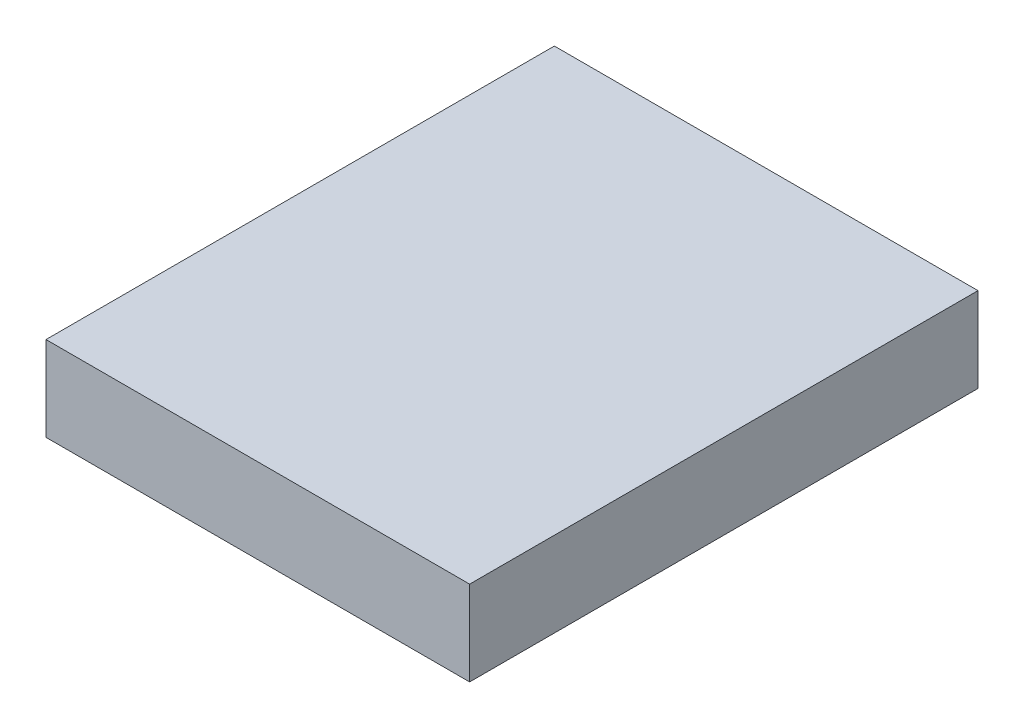
ISO-10303-21;
HEADER;
FILE_DESCRIPTION(('STEP AP214'),'2;1');
FILE_NAME('part.step','',(''),(''),'','','');
FILE_SCHEMA(('AUTOMOTIVE_DESIGN { 1 0 10303 214 1 1 1 1 }'));
ENDSEC;
DATA;
#1=APPLICATION_CONTEXT('core data for automotive mechanical design processes');
#2=APPLICATION_PROTOCOL_DEFINITION('international standard','automotive_design',2000,#1);
#3=PRODUCT_CONTEXT('',#1,'mechanical');
#4=PRODUCT('Part','Part','',(#3));
#5=PRODUCT_RELATED_PRODUCT_CATEGORY('part','',(#4));
#6=PRODUCT_DEFINITION_FORMATION('','',#4);
#7=PRODUCT_DEFINITION_CONTEXT('part definition',#1,'design');
#8=PRODUCT_DEFINITION('design','',#6,#7);
#9=PRODUCT_DEFINITION_SHAPE('','',#8);
#10=(LENGTH_UNIT() NAMED_UNIT(*) SI_UNIT(.MILLI.,.METRE.));
#11=(NAMED_UNIT(*) PLANE_ANGLE_UNIT() SI_UNIT($,.RADIAN.));
#12=(NAMED_UNIT(*) SI_UNIT($,.STERADIAN.) SOLID_ANGLE_UNIT());
#13=UNCERTAINTY_MEASURE_WITH_UNIT(LENGTH_MEASURE(1.E-05),#10,'distance_accuracy_value','');
#14=(GEOMETRIC_REPRESENTATION_CONTEXT(3) GLOBAL_UNCERTAINTY_ASSIGNED_CONTEXT((#13)) GLOBAL_UNIT_ASSIGNED_CONTEXT((#10,
#11,#12)) REPRESENTATION_CONTEXT('',''));
#15=CARTESIAN_POINT('',(0.,0.,0.));
#16=DIRECTION('',(0.,0.,1.));
#17=DIRECTION('',(1.,0.,0.));
#18=AXIS2_PLACEMENT_3D('',#15,#16,#17);
#19=CARTESIAN_POINT('',(-12.5,5.,15.));
#20=DIRECTION('',(1.,0.,0.));
#21=DIRECTION('',(0.,0.,-1.));
#22=AXIS2_PLACEMENT_3D('',#19,#20,#21);
#23=PLANE('',#22);
#24=DIRECTION('',(0.,0.,1.));
#25=VECTOR('',#24,1.);
#26=CARTESIAN_POINT('',(-12.5,0.,15.));
#27=LINE('',#26,#25);
#28=CARTESIAN_POINT('',(-12.5,0.,-15.));
#29=VERTEX_POINT('',#28);
#30=CARTESIAN_POINT('',(-12.5,0.,15.));
#31=VERTEX_POINT('',#30);
#32=EDGE_CURVE('E111',#29,#31,#27,.T.);
#33=ORIENTED_EDGE('',*,*,#32,.T.);
#34=DIRECTION('',(0.,-1.,0.));
#35=VECTOR('',#34,1.);
#36=CARTESIAN_POINT('',(-12.5,5.,15.));
#37=LINE('',#36,#35);
#38=CARTESIAN_POINT('',(-12.5,5.,15.));
#39=VERTEX_POINT('',#38);
#40=EDGE_CURVE('E11',#39,#31,#37,.T.);
#41=ORIENTED_EDGE('',*,*,#40,.F.);
#42=DIRECTION('',(0.,0.,1.));
#43=VECTOR('',#42,1.);
#44=CARTESIAN_POINT('',(-12.5,5.,15.));
#45=LINE('',#44,#43);
#46=CARTESIAN_POINT('',(-12.5,5.,-15.));
#47=VERTEX_POINT('',#46);
#48=EDGE_CURVE('E100',#47,#39,#45,.T.);
#49=ORIENTED_EDGE('',*,*,#48,.F.);
#50=DIRECTION('',(0.,-1.,0.));
#51=VECTOR('',#50,1.);
#52=CARTESIAN_POINT('',(-12.5,5.,-15.));
#53=LINE('',#52,#51);
#54=EDGE_CURVE('E108',#47,#29,#53,.T.);
#55=ORIENTED_EDGE('',*,*,#54,.T.);
#56=EDGE_LOOP('',(#33,#41,#49,#55));
#57=FACE_BOUND('',#56,.T.);
#58=ADVANCED_FACE('F44',(#57),#23,.F.);
#59=CARTESIAN_POINT('',(12.5,5.,15.));
#60=DIRECTION('',(0.,0.,-1.));
#61=DIRECTION('',(-1.,0.,0.));
#62=AXIS2_PLACEMENT_3D('',#59,#60,#61);
#63=PLANE('',#62);
#64=DIRECTION('',(1.,0.,0.));
#65=VECTOR('',#64,1.);
#66=CARTESIAN_POINT('',(12.5,0.,15.));
#67=LINE('',#66,#65);
#68=CARTESIAN_POINT('',(12.5,0.,15.));
#69=VERTEX_POINT('',#68);
#70=EDGE_CURVE('E105',#31,#69,#67,.T.);
#71=ORIENTED_EDGE('',*,*,#70,.T.);
#72=DIRECTION('',(0.,-1.,0.));
#73=VECTOR('',#72,1.);
#74=CARTESIAN_POINT('',(12.5,5.,15.));
#75=LINE('',#74,#73);
#76=CARTESIAN_POINT('',(12.5,5.,15.));
#77=VERTEX_POINT('',#76);
#78=EDGE_CURVE('E53',#77,#69,#75,.T.);
#79=ORIENTED_EDGE('',*,*,#78,.F.);
#80=DIRECTION('',(1.,0.,0.));
#81=VECTOR('',#80,1.);
#82=CARTESIAN_POINT('',(12.5,5.,15.));
#83=LINE('',#82,#81);
#84=EDGE_CURVE('E95',#39,#77,#83,.T.);
#85=ORIENTED_EDGE('',*,*,#84,.F.);
#86=ORIENTED_EDGE('',*,*,#40,.T.);
#87=EDGE_LOOP('',(#71,#79,#85,#86));
#88=FACE_BOUND('',#87,.T.);
#89=ADVANCED_FACE('F102',(#88),#63,.F.);
#90=CARTESIAN_POINT('',(12.5,5.,15.));
#91=DIRECTION('',(-1.,0.,0.));
#92=DIRECTION('',(0.,0.,1.));
#93=AXIS2_PLACEMENT_3D('',#90,#91,#92);
#94=PLANE('',#93);
#95=DIRECTION('',(0.,0.,-1.));
#96=VECTOR('',#95,1.);
#97=CARTESIAN_POINT('',(12.5,0.,15.));
#98=LINE('',#97,#96);
#99=CARTESIAN_POINT('',(12.5,0.,-15.));
#100=VERTEX_POINT('',#99);
#101=EDGE_CURVE('E80',#69,#100,#98,.T.);
#102=ORIENTED_EDGE('',*,*,#101,.T.);
#103=DIRECTION('',(0.,-1.,0.));
#104=VECTOR('',#103,1.);
#105=CARTESIAN_POINT('',(12.5,5.,-15.));
#106=LINE('',#105,#104);
#107=CARTESIAN_POINT('',(12.5,5.,-15.));
#108=VERTEX_POINT('',#107);
#109=EDGE_CURVE('E101',#108,#100,#106,.T.);
#110=ORIENTED_EDGE('',*,*,#109,.F.);
#111=DIRECTION('',(0.,0.,-1.));
#112=VECTOR('',#111,1.);
#113=CARTESIAN_POINT('',(12.5,5.,15.));
#114=LINE('',#113,#112);
#115=EDGE_CURVE('E94',#77,#108,#114,.T.);
#116=ORIENTED_EDGE('',*,*,#115,.F.);
#117=ORIENTED_EDGE('',*,*,#78,.T.);
#118=EDGE_LOOP('',(#102,#110,#116,#117));
#119=FACE_BOUND('',#118,.T.);
#120=ADVANCED_FACE('F103',(#119),#94,.F.);
#121=CARTESIAN_POINT('',(12.5,5.,-15.));
#122=DIRECTION('',(0.,0.,1.));
#123=DIRECTION('',(1.,0.,0.));
#124=AXIS2_PLACEMENT_3D('',#121,#122,#123);
#125=PLANE('',#124);
#126=DIRECTION('',(-1.,0.,0.));
#127=VECTOR('',#126,1.);
#128=CARTESIAN_POINT('',(12.5,0.,-15.));
#129=LINE('',#128,#127);
#130=EDGE_CURVE('E82',#100,#29,#129,.T.);
#131=ORIENTED_EDGE('',*,*,#130,.T.);
#132=ORIENTED_EDGE('',*,*,#54,.F.);
#133=DIRECTION('',(-1.,0.,0.));
#134=VECTOR('',#133,1.);
#135=CARTESIAN_POINT('',(12.5,5.,-15.));
#136=LINE('',#135,#134);
#137=EDGE_CURVE('E62',#108,#47,#136,.T.);
#138=ORIENTED_EDGE('',*,*,#137,.F.);
#139=ORIENTED_EDGE('',*,*,#109,.T.);
#140=EDGE_LOOP('',(#131,#132,#138,#139));
#141=FACE_BOUND('',#140,.T.);
#142=ADVANCED_FACE('F128',(#141),#125,.F.);
#143=CARTESIAN_POINT('',(0.,5.,0.));
#144=DIRECTION('',(0.,1.,0.));
#145=DIRECTION('',(0.,0.,1.));
#146=AXIS2_PLACEMENT_3D('',#143,#144,#145);
#147=PLANE('',#146);
#148=ORIENTED_EDGE('',*,*,#48,.T.);
#149=ORIENTED_EDGE('',*,*,#84,.T.);
#150=ORIENTED_EDGE('',*,*,#115,.T.);
#151=ORIENTED_EDGE('',*,*,#137,.T.);
#152=EDGE_LOOP('',(#148,#149,#150,#151));
#153=FACE_BOUND('',#152,.T.);
#154=ADVANCED_FACE('F93',(#153),#147,.T.);
#155=CARTESIAN_POINT('',(0.,0.,0.));
#156=DIRECTION('',(0.,1.,0.));
#157=DIRECTION('',(0.,0.,1.));
#158=AXIS2_PLACEMENT_3D('',#155,#156,#157);
#159=PLANE('',#158);
#160=ORIENTED_EDGE('',*,*,#32,.F.);
#161=ORIENTED_EDGE('',*,*,#130,.F.);
#162=ORIENTED_EDGE('',*,*,#101,.F.);
#163=ORIENTED_EDGE('',*,*,#70,.F.);
#164=EDGE_LOOP('',(#160,#161,#162,#163));
#165=FACE_BOUND('',#164,.T.);
#166=ADVANCED_FACE('F129',(#165),#159,.F.);
#167=CLOSED_SHELL('',(#58,#89,#120,#142,#154,#166));
#168=MANIFOLD_SOLID_BREP('B2',#167);
#169=ADVANCED_BREP_SHAPE_REPRESENTATION('',(#18,#168),#14);
#170=SHAPE_DEFINITION_REPRESENTATION(#9,#169);
ENDSEC;
END-ISO-10303-21;
